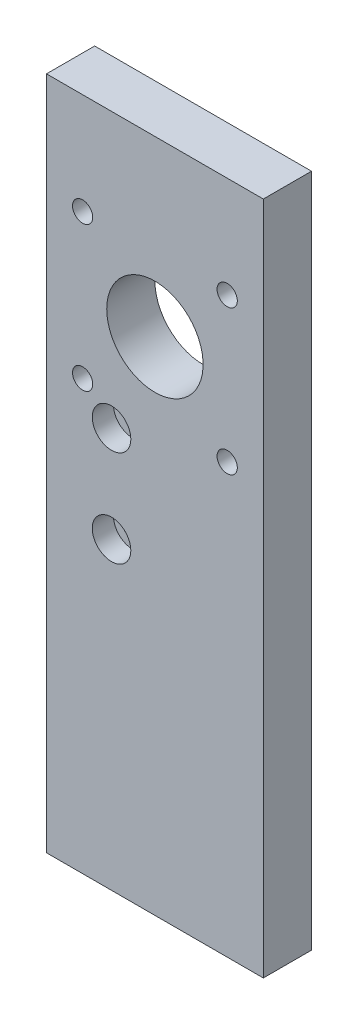
ISO-10303-21;
HEADER;
FILE_DESCRIPTION(('STEP AP214'),'2;1');
FILE_NAME('part.step','',(''),(''),'','','');
FILE_SCHEMA(('AUTOMOTIVE_DESIGN { 1 0 10303 214 1 1 1 1 }'));
ENDSEC;
DATA;
#1=APPLICATION_CONTEXT('core data for automotive mechanical design processes');
#2=APPLICATION_PROTOCOL_DEFINITION('international standard','automotive_design',2000,#1);
#3=PRODUCT_CONTEXT('',#1,'mechanical');
#4=PRODUCT('Part','Part','',(#3));
#5=PRODUCT_RELATED_PRODUCT_CATEGORY('part','',(#4));
#6=PRODUCT_DEFINITION_FORMATION('','',#4);
#7=PRODUCT_DEFINITION_CONTEXT('part definition',#1,'design');
#8=PRODUCT_DEFINITION('design','',#6,#7);
#9=PRODUCT_DEFINITION_SHAPE('','',#8);
#10=(LENGTH_UNIT() NAMED_UNIT(*) SI_UNIT(.MILLI.,.METRE.));
#11=(NAMED_UNIT(*) PLANE_ANGLE_UNIT() SI_UNIT($,.RADIAN.));
#12=(NAMED_UNIT(*) SI_UNIT($,.STERADIAN.) SOLID_ANGLE_UNIT());
#13=UNCERTAINTY_MEASURE_WITH_UNIT(LENGTH_MEASURE(1.E-05),#10,'distance_accuracy_value','');
#14=(GEOMETRIC_REPRESENTATION_CONTEXT(3) GLOBAL_UNCERTAINTY_ASSIGNED_CONTEXT((#13)) GLOBAL_UNIT_ASSIGNED_CONTEXT((#10,
#11,#12)) REPRESENTATION_CONTEXT('',''));
#15=CARTESIAN_POINT('',(0.,0.,0.));
#16=DIRECTION('',(0.,0.,1.));
#17=DIRECTION('',(1.,0.,0.));
#18=AXIS2_PLACEMENT_3D('',#15,#16,#17);
#19=CARTESIAN_POINT('',(-22.5,140.,5.));
#20=DIRECTION('',(1.,0.,0.));
#21=DIRECTION('',(0.,1.,0.));
#22=AXIS2_PLACEMENT_3D('',#19,#20,#21);
#23=PLANE('',#22);
#24=DIRECTION('',(0.,-1.,0.));
#25=VECTOR('',#24,1.);
#26=CARTESIAN_POINT('',(-22.5,140.,-5.));
#27=LINE('',#26,#25);
#28=CARTESIAN_POINT('',(-22.5,140.,-5.));
#29=VERTEX_POINT('',#28);
#30=CARTESIAN_POINT('',(-22.5,0.,-5.));
#31=VERTEX_POINT('',#30);
#32=EDGE_CURVE('E185',#29,#31,#27,.T.);
#33=ORIENTED_EDGE('',*,*,#32,.T.);
#34=DIRECTION('',(0.,0.,-1.));
#35=VECTOR('',#34,1.);
#36=CARTESIAN_POINT('',(-22.5,0.,5.));
#37=LINE('',#36,#35);
#38=CARTESIAN_POINT('',(-22.5,0.,5.));
#39=VERTEX_POINT('',#38);
#40=EDGE_CURVE('E11',#39,#31,#37,.T.);
#41=ORIENTED_EDGE('',*,*,#40,.F.);
#42=DIRECTION('',(0.,-1.,0.));
#43=VECTOR('',#42,1.);
#44=CARTESIAN_POINT('',(-22.5,140.,5.));
#45=LINE('',#44,#43);
#46=CARTESIAN_POINT('',(-22.5,140.,5.));
#47=VERTEX_POINT('',#46);
#48=EDGE_CURVE('E186',#47,#39,#45,.T.);
#49=ORIENTED_EDGE('',*,*,#48,.F.);
#50=DIRECTION('',(0.,0.,-1.));
#51=VECTOR('',#50,1.);
#52=CARTESIAN_POINT('',(-22.5,140.,5.));
#53=LINE('',#52,#51);
#54=EDGE_CURVE('E194',#47,#29,#53,.T.);
#55=ORIENTED_EDGE('',*,*,#54,.T.);
#56=EDGE_LOOP('',(#33,#41,#49,#55));
#57=FACE_BOUND('',#56,.T.);
#58=ADVANCED_FACE('F44',(#57),#23,.F.);
#59=CARTESIAN_POINT('',(-22.5,0.,5.));
#60=DIRECTION('',(0.,1.,0.));
#61=DIRECTION('',(0.,0.,1.));
#62=AXIS2_PLACEMENT_3D('',#59,#60,#61);
#63=PLANE('',#62);
#64=CARTESIAN_POINT('',(-15.,0.,0.));
#65=DIRECTION('',(0.,-1.,0.));
#66=DIRECTION('',(0.,0.,-1.));
#67=AXIS2_PLACEMENT_3D('',#64,#65,#66);
#68=CIRCLE('',#67,2.);
#69=CARTESIAN_POINT('',(-15.,0.,-2.));
#70=VERTEX_POINT('',#69);
#71=EDGE_CURVE('E116',#70,#70,#68,.T.);
#72=ORIENTED_EDGE('',*,*,#71,.F.);
#73=EDGE_LOOP('',(#72));
#74=FACE_BOUND('',#73,.T.);
#75=CARTESIAN_POINT('',(15.,0.,0.));
#76=DIRECTION('',(0.,-1.,0.));
#77=DIRECTION('',(0.,0.,-1.));
#78=AXIS2_PLACEMENT_3D('',#75,#76,#77);
#79=CIRCLE('',#78,2.);
#80=CARTESIAN_POINT('',(15.,0.,-2.));
#81=VERTEX_POINT('',#80);
#82=EDGE_CURVE('E115',#81,#81,#79,.T.);
#83=ORIENTED_EDGE('',*,*,#82,.F.);
#84=EDGE_LOOP('',(#83));
#85=FACE_BOUND('',#84,.T.);
#86=CARTESIAN_POINT('',(0.,0.,0.));
#87=DIRECTION('',(0.,-1.,0.));
#88=DIRECTION('',(0.,0.,-1.));
#89=AXIS2_PLACEMENT_3D('',#86,#87,#88);
#90=CIRCLE('',#89,2.09999999999999);
#91=CARTESIAN_POINT('',(0.,0.,-2.09999999999999));
#92=VERTEX_POINT('',#91);
#93=EDGE_CURVE('E130',#92,#92,#90,.T.);
#94=ORIENTED_EDGE('',*,*,#93,.F.);
#95=EDGE_LOOP('',(#94));
#96=FACE_BOUND('',#95,.T.);
#97=DIRECTION('',(1.,0.,0.));
#98=VECTOR('',#97,1.);
#99=CARTESIAN_POINT('',(-22.5,0.,-5.));
#100=LINE('',#99,#98);
#101=CARTESIAN_POINT('',(22.5,0.,-5.));
#102=VERTEX_POINT('',#101);
#103=EDGE_CURVE('E198',#31,#102,#100,.T.);
#104=ORIENTED_EDGE('',*,*,#103,.T.);
#105=DIRECTION('',(0.,0.,-1.));
#106=VECTOR('',#105,1.);
#107=CARTESIAN_POINT('',(22.5,0.,5.));
#108=LINE('',#107,#106);
#109=CARTESIAN_POINT('',(22.5,0.,5.));
#110=VERTEX_POINT('',#109);
#111=EDGE_CURVE('E52',#110,#102,#108,.T.);
#112=ORIENTED_EDGE('',*,*,#111,.F.);
#113=DIRECTION('',(1.,0.,0.));
#114=VECTOR('',#113,1.);
#115=CARTESIAN_POINT('',(-22.5,0.,5.));
#116=LINE('',#115,#114);
#117=EDGE_CURVE('E91',#39,#110,#116,.T.);
#118=ORIENTED_EDGE('',*,*,#117,.F.);
#119=ORIENTED_EDGE('',*,*,#40,.T.);
#120=EDGE_LOOP('',(#104,#112,#118,#119));
#121=FACE_BOUND('',#120,.T.);
#122=ADVANCED_FACE('F222',(#74,#85,#96,#121),#63,.F.);
#123=CARTESIAN_POINT('',(22.5,140.,5.));
#124=DIRECTION('',(-1.,0.,0.));
#125=DIRECTION('',(0.,-1.,0.));
#126=AXIS2_PLACEMENT_3D('',#123,#124,#125);
#127=PLANE('',#126);
#128=DIRECTION('',(0.,1.,0.));
#129=VECTOR('',#128,1.);
#130=CARTESIAN_POINT('',(22.5,140.,-5.));
#131=LINE('',#130,#129);
#132=CARTESIAN_POINT('',(22.5,140.,-5.));
#133=VERTEX_POINT('',#132);
#134=EDGE_CURVE('E78',#102,#133,#131,.T.);
#135=ORIENTED_EDGE('',*,*,#134,.T.);
#136=DIRECTION('',(0.,0.,-1.));
#137=VECTOR('',#136,1.);
#138=CARTESIAN_POINT('',(22.5,140.,5.));
#139=LINE('',#138,#137);
#140=CARTESIAN_POINT('',(22.5,140.,5.));
#141=VERTEX_POINT('',#140);
#142=EDGE_CURVE('E203',#141,#133,#139,.T.);
#143=ORIENTED_EDGE('',*,*,#142,.F.);
#144=DIRECTION('',(0.,1.,0.));
#145=VECTOR('',#144,1.);
#146=CARTESIAN_POINT('',(22.5,140.,5.));
#147=LINE('',#146,#145);
#148=EDGE_CURVE('E190',#110,#141,#147,.T.);
#149=ORIENTED_EDGE('',*,*,#148,.F.);
#150=ORIENTED_EDGE('',*,*,#111,.T.);
#151=EDGE_LOOP('',(#135,#143,#149,#150));
#152=FACE_BOUND('',#151,.T.);
#153=ADVANCED_FACE('F205',(#152),#127,.F.);
#154=CARTESIAN_POINT('',(-22.5,140.,5.));
#155=DIRECTION('',(0.,-1.,0.));
#156=DIRECTION('',(0.,0.,-1.));
#157=AXIS2_PLACEMENT_3D('',#154,#155,#156);
#158=PLANE('',#157);
#159=DIRECTION('',(-1.,0.,0.));
#160=VECTOR('',#159,1.);
#161=CARTESIAN_POINT('',(-22.5,140.,-5.));
#162=LINE('',#161,#160);
#163=EDGE_CURVE('E84',#133,#29,#162,.T.);
#164=ORIENTED_EDGE('',*,*,#163,.T.);
#165=ORIENTED_EDGE('',*,*,#54,.F.);
#166=DIRECTION('',(-1.,0.,0.));
#167=VECTOR('',#166,1.);
#168=CARTESIAN_POINT('',(-22.5,140.,5.));
#169=LINE('',#168,#167);
#170=EDGE_CURVE('E60',#141,#47,#169,.T.);
#171=ORIENTED_EDGE('',*,*,#170,.F.);
#172=ORIENTED_EDGE('',*,*,#142,.T.);
#173=EDGE_LOOP('',(#164,#165,#171,#172));
#174=FACE_BOUND('',#173,.T.);
#175=ADVANCED_FACE('F212',(#174),#158,.F.);
#176=CARTESIAN_POINT('',(0.,0.,5.));
#177=DIRECTION('',(0.,0.,1.));
#178=DIRECTION('',(1.,0.,0.));
#179=AXIS2_PLACEMENT_3D('',#176,#177,#178);
#180=PLANE('',#179);
#181=CARTESIAN_POINT('',(0.,104.,5.));
#182=DIRECTION('',(0.,0.,-1.));
#183=DIRECTION('',(-1.,0.,0.));
#184=AXIS2_PLACEMENT_3D('',#181,#182,#183);
#185=CIRCLE('',#184,10.);
#186=CARTESIAN_POINT('',(-10.,104.,5.));
#187=VERTEX_POINT('',#186);
#188=EDGE_CURVE('E355',#187,#187,#185,.T.);
#189=ORIENTED_EDGE('',*,*,#188,.T.);
#190=EDGE_LOOP('',(#189));
#191=FACE_BOUND('',#190,.T.);
#192=CARTESIAN_POINT('',(-9.,63.08,5.));
#193=DIRECTION('',(0.,0.,1.));
#194=DIRECTION('',(1.,0.,0.));
#195=AXIS2_PLACEMENT_3D('',#192,#193,#194);
#196=CIRCLE('',#195,4.);
#197=CARTESIAN_POINT('',(-5.,63.08,5.));
#198=VERTEX_POINT('',#197);
#199=EDGE_CURVE('E137',#198,#198,#196,.T.);
#200=ORIENTED_EDGE('',*,*,#199,.F.);
#201=EDGE_LOOP('',(#200));
#202=FACE_BOUND('',#201,.T.);
#203=CARTESIAN_POINT('',(15.,119.,5.));
#204=DIRECTION('',(0.,0.,1.));
#205=DIRECTION('',(1.,0.,0.));
#206=AXIS2_PLACEMENT_3D('',#203,#204,#205);
#207=CIRCLE('',#206,2.1);
#208=CARTESIAN_POINT('',(17.1,119.,5.));
#209=VERTEX_POINT('',#208);
#210=EDGE_CURVE('E149',#209,#209,#207,.T.);
#211=ORIENTED_EDGE('',*,*,#210,.F.);
#212=EDGE_LOOP('',(#211));
#213=FACE_BOUND('',#212,.T.);
#214=CARTESIAN_POINT('',(-15.,89.,5.));
#215=DIRECTION('',(0.,0.,1.));
#216=DIRECTION('',(1.,0.,0.));
#217=AXIS2_PLACEMENT_3D('',#214,#215,#216);
#218=CIRCLE('',#217,2.1);
#219=CARTESIAN_POINT('',(-12.9,89.,5.));
#220=VERTEX_POINT('',#219);
#221=EDGE_CURVE('E155',#220,#220,#218,.T.);
#222=ORIENTED_EDGE('',*,*,#221,.F.);
#223=EDGE_LOOP('',(#222));
#224=FACE_BOUND('',#223,.T.);
#225=CARTESIAN_POINT('',(-15.,119.,5.));
#226=DIRECTION('',(0.,0.,1.));
#227=DIRECTION('',(1.,0.,0.));
#228=AXIS2_PLACEMENT_3D('',#225,#226,#227);
#229=CIRCLE('',#228,2.1);
#230=CARTESIAN_POINT('',(-12.9,119.,5.));
#231=VERTEX_POINT('',#230);
#232=EDGE_CURVE('E161',#231,#231,#229,.T.);
#233=ORIENTED_EDGE('',*,*,#232,.F.);
#234=EDGE_LOOP('',(#233));
#235=FACE_BOUND('',#234,.T.);
#236=CARTESIAN_POINT('',(15.,89.,5.));
#237=DIRECTION('',(0.,0.,1.));
#238=DIRECTION('',(1.,0.,0.));
#239=AXIS2_PLACEMENT_3D('',#236,#237,#238);
#240=CIRCLE('',#239,2.1);
#241=CARTESIAN_POINT('',(17.1,89.,5.));
#242=VERTEX_POINT('',#241);
#243=EDGE_CURVE('E167',#242,#242,#240,.T.);
#244=ORIENTED_EDGE('',*,*,#243,.F.);
#245=EDGE_LOOP('',(#244));
#246=FACE_BOUND('',#245,.T.);
#247=CARTESIAN_POINT('',(-9.,83.08,5.));
#248=DIRECTION('',(0.,0.,1.));
#249=DIRECTION('',(1.,0.,0.));
#250=AXIS2_PLACEMENT_3D('',#247,#248,#249);
#251=CIRCLE('',#250,4.);
#252=CARTESIAN_POINT('',(-5.,83.08,5.));
#253=VERTEX_POINT('',#252);
#254=EDGE_CURVE('E173',#253,#253,#251,.T.);
#255=ORIENTED_EDGE('',*,*,#254,.F.);
#256=EDGE_LOOP('',(#255));
#257=FACE_BOUND('',#256,.T.);
#258=ORIENTED_EDGE('',*,*,#48,.T.);
#259=ORIENTED_EDGE('',*,*,#117,.T.);
#260=ORIENTED_EDGE('',*,*,#148,.T.);
#261=ORIENTED_EDGE('',*,*,#170,.T.);
#262=EDGE_LOOP('',(#258,#259,#260,#261));
#263=FACE_BOUND('',#262,.T.);
#264=ADVANCED_FACE('F214',(#191,#202,#213,#224,#235,#246,#257,#263),#180,.T.);
#265=CARTESIAN_POINT('',(0.,0.,-5.));
#266=DIRECTION('',(0.,0.,1.));
#267=DIRECTION('',(1.,0.,0.));
#268=AXIS2_PLACEMENT_3D('',#265,#266,#267);
#269=PLANE('',#268);
#270=CARTESIAN_POINT('',(0.,104.,-5.));
#271=DIRECTION('',(0.,0.,-1.));
#272=DIRECTION('',(-1.,0.,0.));
#273=AXIS2_PLACEMENT_3D('',#270,#271,#272);
#274=CIRCLE('',#273,9.99999999999999);
#275=CARTESIAN_POINT('',(-9.99999999999999,104.,-5.));
#276=VERTEX_POINT('',#275);
#277=EDGE_CURVE('E301',#276,#276,#274,.T.);
#278=ORIENTED_EDGE('',*,*,#277,.F.);
#279=EDGE_LOOP('',(#278));
#280=FACE_BOUND('',#279,.T.);
#281=CARTESIAN_POINT('',(-17.5,76.5,-5.));
#282=DIRECTION('',(0.,0.,-1.));
#283=DIRECTION('',(-1.,0.,0.));
#284=AXIS2_PLACEMENT_3D('',#281,#282,#283);
#285=CIRCLE('',#284,1.5);
#286=CARTESIAN_POINT('',(-19.,76.5,-5.));
#287=VERTEX_POINT('',#286);
#288=EDGE_CURVE('E305',#287,#287,#285,.T.);
#289=ORIENTED_EDGE('',*,*,#288,.F.);
#290=EDGE_LOOP('',(#289));
#291=FACE_BOUND('',#290,.T.);
#292=CARTESIAN_POINT('',(2.49999999999999,76.5,-5.));
#293=DIRECTION('',(0.,0.,-1.));
#294=DIRECTION('',(-1.,0.,0.));
#295=AXIS2_PLACEMENT_3D('',#292,#293,#294);
#296=CIRCLE('',#295,1.5);
#297=CARTESIAN_POINT('',(0.999999999999993,76.5,-5.));
#298=VERTEX_POINT('',#297);
#299=EDGE_CURVE('E309',#298,#298,#296,.T.);
#300=ORIENTED_EDGE('',*,*,#299,.F.);
#301=EDGE_LOOP('',(#300));
#302=FACE_BOUND('',#301,.T.);
#303=CARTESIAN_POINT('',(-9.,63.08,-5.));
#304=DIRECTION('',(0.,0.,1.));
#305=DIRECTION('',(1.,0.,0.));
#306=AXIS2_PLACEMENT_3D('',#303,#304,#305);
#307=CIRCLE('',#306,2.25);
#308=CARTESIAN_POINT('',(-6.75,63.08,-5.));
#309=VERTEX_POINT('',#308);
#310=EDGE_CURVE('E140',#309,#309,#307,.T.);
#311=ORIENTED_EDGE('',*,*,#310,.T.);
#312=EDGE_LOOP('',(#311));
#313=FACE_BOUND('',#312,.T.);
#314=CARTESIAN_POINT('',(15.,119.,-5.));
#315=DIRECTION('',(0.,0.,1.));
#316=DIRECTION('',(1.,0.,0.));
#317=AXIS2_PLACEMENT_3D('',#314,#315,#316);
#318=CIRCLE('',#317,2.1);
#319=CARTESIAN_POINT('',(17.1,119.,-5.));
#320=VERTEX_POINT('',#319);
#321=EDGE_CURVE('E152',#320,#320,#318,.T.);
#322=ORIENTED_EDGE('',*,*,#321,.T.);
#323=EDGE_LOOP('',(#322));
#324=FACE_BOUND('',#323,.T.);
#325=CARTESIAN_POINT('',(-15.,89.,-5.));
#326=DIRECTION('',(0.,0.,1.));
#327=DIRECTION('',(1.,0.,0.));
#328=AXIS2_PLACEMENT_3D('',#325,#326,#327);
#329=CIRCLE('',#328,2.1);
#330=CARTESIAN_POINT('',(-12.9,89.,-5.));
#331=VERTEX_POINT('',#330);
#332=EDGE_CURVE('E158',#331,#331,#329,.T.);
#333=ORIENTED_EDGE('',*,*,#332,.T.);
#334=EDGE_LOOP('',(#333));
#335=FACE_BOUND('',#334,.T.);
#336=CARTESIAN_POINT('',(-15.,119.,-5.));
#337=DIRECTION('',(0.,0.,1.));
#338=DIRECTION('',(1.,0.,0.));
#339=AXIS2_PLACEMENT_3D('',#336,#337,#338);
#340=CIRCLE('',#339,2.1);
#341=CARTESIAN_POINT('',(-12.9,119.,-5.));
#342=VERTEX_POINT('',#341);
#343=EDGE_CURVE('E164',#342,#342,#340,.T.);
#344=ORIENTED_EDGE('',*,*,#343,.T.);
#345=EDGE_LOOP('',(#344));
#346=FACE_BOUND('',#345,.T.);
#347=CARTESIAN_POINT('',(15.,89.,-5.));
#348=DIRECTION('',(0.,0.,1.));
#349=DIRECTION('',(1.,0.,0.));
#350=AXIS2_PLACEMENT_3D('',#347,#348,#349);
#351=CIRCLE('',#350,2.1);
#352=CARTESIAN_POINT('',(17.1,89.,-5.));
#353=VERTEX_POINT('',#352);
#354=EDGE_CURVE('E170',#353,#353,#351,.T.);
#355=ORIENTED_EDGE('',*,*,#354,.T.);
#356=EDGE_LOOP('',(#355));
#357=FACE_BOUND('',#356,.T.);
#358=CARTESIAN_POINT('',(-9.,83.08,-5.));
#359=DIRECTION('',(0.,0.,1.));
#360=DIRECTION('',(1.,0.,0.));
#361=AXIS2_PLACEMENT_3D('',#358,#359,#360);
#362=CIRCLE('',#361,2.25);
#363=CARTESIAN_POINT('',(-6.75,83.08,-5.));
#364=VERTEX_POINT('',#363);
#365=EDGE_CURVE('E182',#364,#364,#362,.T.);
#366=ORIENTED_EDGE('',*,*,#365,.T.);
#367=EDGE_LOOP('',(#366));
#368=FACE_BOUND('',#367,.T.);
#369=ORIENTED_EDGE('',*,*,#32,.F.);
#370=ORIENTED_EDGE('',*,*,#163,.F.);
#371=ORIENTED_EDGE('',*,*,#134,.F.);
#372=ORIENTED_EDGE('',*,*,#103,.F.);
#373=EDGE_LOOP('',(#369,#370,#371,#372));
#374=FACE_BOUND('',#373,.T.);
#375=ADVANCED_FACE('F208',(#280,#291,#302,#313,#324,#335,#346,#357,#368,#374),#269,.F.);
#376=CARTESIAN_POINT('',(-9.,83.08,5.));
#377=DIRECTION('',(0.,0.,1.));
#378=DIRECTION('',(1.,0.,0.));
#379=AXIS2_PLACEMENT_3D('',#376,#377,#378);
#380=CYLINDRICAL_SURFACE('',#379,2.25);
#381=ORIENTED_EDGE('',*,*,#365,.F.);
#382=EDGE_LOOP('',(#381));
#383=FACE_BOUND('',#382,.T.);
#384=CARTESIAN_POINT('',(-9.,83.08,0.6));
#385=DIRECTION('',(0.,0.,1.));
#386=DIRECTION('',(1.,0.,0.));
#387=AXIS2_PLACEMENT_3D('',#384,#385,#386);
#388=CIRCLE('',#387,2.25);
#389=CARTESIAN_POINT('',(-6.75,83.08,0.6));
#390=VERTEX_POINT('',#389);
#391=EDGE_CURVE('E179',#390,#390,#388,.T.);
#392=ORIENTED_EDGE('',*,*,#391,.T.);
#393=EDGE_LOOP('',(#392));
#394=FACE_BOUND('',#393,.T.);
#395=ADVANCED_FACE('F290',(#383,#394),#380,.F.);
#396=CARTESIAN_POINT('',(-6.75,83.08,0.6));
#397=DIRECTION('',(0.,0.,-1.));
#398=DIRECTION('',(-1.,0.,0.));
#399=AXIS2_PLACEMENT_3D('',#396,#397,#398);
#400=PLANE('',#399);
#401=ORIENTED_EDGE('',*,*,#391,.F.);
#402=EDGE_LOOP('',(#401));
#403=FACE_BOUND('',#402,.T.);
#404=CARTESIAN_POINT('',(-9.,83.08,0.6));
#405=DIRECTION('',(0.,0.,1.));
#406=DIRECTION('',(1.,0.,0.));
#407=AXIS2_PLACEMENT_3D('',#404,#405,#406);
#408=CIRCLE('',#407,4.);
#409=CARTESIAN_POINT('',(-5.,83.08,0.6));
#410=VERTEX_POINT('',#409);
#411=EDGE_CURVE('E176',#410,#410,#408,.T.);
#412=ORIENTED_EDGE('',*,*,#411,.T.);
#413=EDGE_LOOP('',(#412));
#414=FACE_BOUND('',#413,.T.);
#415=ADVANCED_FACE('F286',(#403,#414),#400,.F.);
#416=CARTESIAN_POINT('',(-9.,83.08,5.));
#417=DIRECTION('',(0.,0.,1.));
#418=DIRECTION('',(1.,0.,0.));
#419=AXIS2_PLACEMENT_3D('',#416,#417,#418);
#420=CYLINDRICAL_SURFACE('',#419,4.);
#421=ORIENTED_EDGE('',*,*,#411,.F.);
#422=EDGE_LOOP('',(#421));
#423=FACE_BOUND('',#422,.T.);
#424=ORIENTED_EDGE('',*,*,#254,.T.);
#425=EDGE_LOOP('',(#424));
#426=FACE_BOUND('',#425,.T.);
#427=ADVANCED_FACE('F282',(#423,#426),#420,.F.);
#428=CARTESIAN_POINT('',(15.,89.,5.));
#429=DIRECTION('',(0.,0.,1.));
#430=DIRECTION('',(1.,0.,0.));
#431=AXIS2_PLACEMENT_3D('',#428,#429,#430);
#432=CYLINDRICAL_SURFACE('',#431,2.1);
#433=ORIENTED_EDGE('',*,*,#354,.F.);
#434=EDGE_LOOP('',(#433));
#435=FACE_BOUND('',#434,.T.);
#436=ORIENTED_EDGE('',*,*,#243,.T.);
#437=EDGE_LOOP('',(#436));
#438=FACE_BOUND('',#437,.T.);
#439=ADVANCED_FACE('F278',(#435,#438),#432,.F.);
#440=CARTESIAN_POINT('',(-15.,119.,5.));
#441=DIRECTION('',(0.,0.,1.));
#442=DIRECTION('',(1.,0.,0.));
#443=AXIS2_PLACEMENT_3D('',#440,#441,#442);
#444=CYLINDRICAL_SURFACE('',#443,2.1);
#445=ORIENTED_EDGE('',*,*,#343,.F.);
#446=EDGE_LOOP('',(#445));
#447=FACE_BOUND('',#446,.T.);
#448=ORIENTED_EDGE('',*,*,#232,.T.);
#449=EDGE_LOOP('',(#448));
#450=FACE_BOUND('',#449,.T.);
#451=ADVANCED_FACE('F274',(#447,#450),#444,.F.);
#452=CARTESIAN_POINT('',(-15.,89.,5.));
#453=DIRECTION('',(0.,0.,1.));
#454=DIRECTION('',(1.,0.,0.));
#455=AXIS2_PLACEMENT_3D('',#452,#453,#454);
#456=CYLINDRICAL_SURFACE('',#455,2.1);
#457=ORIENTED_EDGE('',*,*,#332,.F.);
#458=EDGE_LOOP('',(#457));
#459=FACE_BOUND('',#458,.T.);
#460=ORIENTED_EDGE('',*,*,#221,.T.);
#461=EDGE_LOOP('',(#460));
#462=FACE_BOUND('',#461,.T.);
#463=ADVANCED_FACE('F270',(#459,#462),#456,.F.);
#464=CARTESIAN_POINT('',(15.,119.,5.));
#465=DIRECTION('',(0.,0.,1.));
#466=DIRECTION('',(1.,0.,0.));
#467=AXIS2_PLACEMENT_3D('',#464,#465,#466);
#468=CYLINDRICAL_SURFACE('',#467,2.1);
#469=ORIENTED_EDGE('',*,*,#321,.F.);
#470=EDGE_LOOP('',(#469));
#471=FACE_BOUND('',#470,.T.);
#472=ORIENTED_EDGE('',*,*,#210,.T.);
#473=EDGE_LOOP('',(#472));
#474=FACE_BOUND('',#473,.T.);
#475=ADVANCED_FACE('F266',(#471,#474),#468,.F.);
#476=CARTESIAN_POINT('',(-9.,63.08,5.));
#477=DIRECTION('',(0.,0.,1.));
#478=DIRECTION('',(1.,0.,0.));
#479=AXIS2_PLACEMENT_3D('',#476,#477,#478);
#480=CYLINDRICAL_SURFACE('',#479,2.25);
#481=ORIENTED_EDGE('',*,*,#310,.F.);
#482=EDGE_LOOP('',(#481));
#483=FACE_BOUND('',#482,.T.);
#484=CARTESIAN_POINT('',(-9.,63.08,0.6));
#485=DIRECTION('',(0.,0.,1.));
#486=DIRECTION('',(1.,0.,0.));
#487=AXIS2_PLACEMENT_3D('',#484,#485,#486);
#488=CIRCLE('',#487,2.25);
#489=CARTESIAN_POINT('',(-6.75,63.08,0.6));
#490=VERTEX_POINT('',#489);
#491=EDGE_CURVE('E146',#490,#490,#488,.T.);
#492=ORIENTED_EDGE('',*,*,#491,.T.);
#493=EDGE_LOOP('',(#492));
#494=FACE_BOUND('',#493,.T.);
#495=ADVANCED_FACE('F262',(#483,#494),#480,.F.);
#496=CARTESIAN_POINT('',(-6.75,63.08,0.6));
#497=DIRECTION('',(0.,0.,-1.));
#498=DIRECTION('',(-1.,0.,0.));
#499=AXIS2_PLACEMENT_3D('',#496,#497,#498);
#500=PLANE('',#499);
#501=ORIENTED_EDGE('',*,*,#491,.F.);
#502=EDGE_LOOP('',(#501));
#503=FACE_BOUND('',#502,.T.);
#504=CARTESIAN_POINT('',(-9.,63.08,0.6));
#505=DIRECTION('',(0.,0.,1.));
#506=DIRECTION('',(1.,0.,0.));
#507=AXIS2_PLACEMENT_3D('',#504,#505,#506);
#508=CIRCLE('',#507,4.);
#509=CARTESIAN_POINT('',(-5.,63.08,0.6));
#510=VERTEX_POINT('',#509);
#511=EDGE_CURVE('E143',#510,#510,#508,.T.);
#512=ORIENTED_EDGE('',*,*,#511,.T.);
#513=EDGE_LOOP('',(#512));
#514=FACE_BOUND('',#513,.T.);
#515=ADVANCED_FACE('F258',(#503,#514),#500,.F.);
#516=CARTESIAN_POINT('',(-9.,63.08,5.));
#517=DIRECTION('',(0.,0.,1.));
#518=DIRECTION('',(1.,0.,0.));
#519=AXIS2_PLACEMENT_3D('',#516,#517,#518);
#520=CYLINDRICAL_SURFACE('',#519,4.);
#521=ORIENTED_EDGE('',*,*,#511,.F.);
#522=EDGE_LOOP('',(#521));
#523=FACE_BOUND('',#522,.T.);
#524=ORIENTED_EDGE('',*,*,#199,.T.);
#525=EDGE_LOOP('',(#524));
#526=FACE_BOUND('',#525,.T.);
#527=ADVANCED_FACE('F250',(#523,#526),#520,.F.);
#528=CARTESIAN_POINT('',(0.,14.,0.));
#529=DIRECTION('',(0.,-1.,0.));
#530=DIRECTION('',(0.,0.,-1.));
#531=AXIS2_PLACEMENT_3D('',#528,#529,#530);
#532=CONICAL_SURFACE('',#531,2.09999999999999,1.02974425867665);
#533=CARTESIAN_POINT('',(0.,15.2618072999579,0.));
#534=VERTEX_POINT('',#533);
#535=VERTEX_LOOP('',#534);
#536=FACE_BOUND('',#535,.T.);
#537=CARTESIAN_POINT('',(0.,14.,0.));
#538=DIRECTION('',(0.,-1.,0.));
#539=DIRECTION('',(0.,0.,-1.));
#540=AXIS2_PLACEMENT_3D('',#537,#538,#539);
#541=CIRCLE('',#540,2.09999999999999);
#542=CARTESIAN_POINT('',(0.,14.,-2.09999999999999));
#543=VERTEX_POINT('',#542);
#544=EDGE_CURVE('E133',#543,#543,#541,.T.);
#545=ORIENTED_EDGE('',*,*,#544,.T.);
#546=EDGE_LOOP('',(#545));
#547=FACE_BOUND('',#546,.T.);
#548=ADVANCED_FACE('F241',(#536,#547),#532,.F.);
#549=CARTESIAN_POINT('',(0.,0.,0.));
#550=DIRECTION('',(0.,-1.,0.));
#551=DIRECTION('',(0.,0.,-1.));
#552=AXIS2_PLACEMENT_3D('',#549,#550,#551);
#553=CYLINDRICAL_SURFACE('',#552,2.09999999999999);
#554=ORIENTED_EDGE('',*,*,#544,.F.);
#555=EDGE_LOOP('',(#554));
#556=FACE_BOUND('',#555,.T.);
#557=ORIENTED_EDGE('',*,*,#93,.T.);
#558=EDGE_LOOP('',(#557));
#559=FACE_BOUND('',#558,.T.);
#560=ADVANCED_FACE('F238',(#556,#559),#553,.F.);
#561=CARTESIAN_POINT('',(15.,14.,0.));
#562=DIRECTION('',(0.,-1.,0.));
#563=DIRECTION('',(0.,0.,-1.));
#564=AXIS2_PLACEMENT_3D('',#561,#562,#563);
#565=CONICAL_SURFACE('',#564,1.99999999999999,1.02974425867665);
#566=CARTESIAN_POINT('',(15.,15.2017212380551,0.));
#567=VERTEX_POINT('',#566);
#568=VERTEX_LOOP('',#567);
#569=FACE_BOUND('',#568,.T.);
#570=CARTESIAN_POINT('',(15.,14.,0.));
#571=DIRECTION('',(0.,-1.,0.));
#572=DIRECTION('',(0.,0.,-1.));
#573=AXIS2_PLACEMENT_3D('',#570,#571,#572);
#574=CIRCLE('',#573,1.99999999999999);
#575=CARTESIAN_POINT('',(15.,14.,-1.99999999999999));
#576=VERTEX_POINT('',#575);
#577=EDGE_CURVE('E120',#576,#576,#574,.T.);
#578=ORIENTED_EDGE('',*,*,#577,.T.);
#579=EDGE_LOOP('',(#578));
#580=FACE_BOUND('',#579,.T.);
#581=ADVANCED_FACE('F240',(#569,#580),#565,.F.);
#582=CARTESIAN_POINT('',(15.,0.,0.));
#583=DIRECTION('',(0.,-1.,0.));
#584=DIRECTION('',(0.,0.,-1.));
#585=AXIS2_PLACEMENT_3D('',#582,#583,#584);
#586=CYLINDRICAL_SURFACE('',#585,2.);
#587=ORIENTED_EDGE('',*,*,#577,.F.);
#588=EDGE_LOOP('',(#587));
#589=FACE_BOUND('',#588,.T.);
#590=ORIENTED_EDGE('',*,*,#82,.T.);
#591=EDGE_LOOP('',(#590));
#592=FACE_BOUND('',#591,.T.);
#593=ADVANCED_FACE('F108',(#589,#592),#586,.F.);
#594=CARTESIAN_POINT('',(-15.,14.,0.));
#595=DIRECTION('',(0.,-1.,0.));
#596=DIRECTION('',(0.,0.,-1.));
#597=AXIS2_PLACEMENT_3D('',#594,#595,#596);
#598=CONICAL_SURFACE('',#597,2.,1.02974425867665);
#599=CARTESIAN_POINT('',(-15.,15.2017212380551,0.));
#600=VERTEX_POINT('',#599);
#601=VERTEX_LOOP('',#600);
#602=FACE_BOUND('',#601,.T.);
#603=CARTESIAN_POINT('',(-15.,14.,0.));
#604=DIRECTION('',(0.,-1.,0.));
#605=DIRECTION('',(0.,0.,-1.));
#606=AXIS2_PLACEMENT_3D('',#603,#604,#605);
#607=CIRCLE('',#606,2.);
#608=CARTESIAN_POINT('',(-15.,14.,-2.));
#609=VERTEX_POINT('',#608);
#610=EDGE_CURVE('E112',#609,#609,#607,.T.);
#611=ORIENTED_EDGE('',*,*,#610,.T.);
#612=EDGE_LOOP('',(#611));
#613=FACE_BOUND('',#612,.T.);
#614=ADVANCED_FACE('F104',(#602,#613),#598,.F.);
#615=CARTESIAN_POINT('',(-15.,0.,0.));
#616=DIRECTION('',(0.,-1.,0.));
#617=DIRECTION('',(0.,0.,-1.));
#618=AXIS2_PLACEMENT_3D('',#615,#616,#617);
#619=CYLINDRICAL_SURFACE('',#618,2.);
#620=ORIENTED_EDGE('',*,*,#610,.F.);
#621=EDGE_LOOP('',(#620));
#622=FACE_BOUND('',#621,.T.);
#623=ORIENTED_EDGE('',*,*,#71,.T.);
#624=EDGE_LOOP('',(#623));
#625=FACE_BOUND('',#624,.T.);
#626=ADVANCED_FACE('F107',(#622,#625),#619,.F.);
#627=CARTESIAN_POINT('',(2.49999999999999,76.5,3.));
#628=DIRECTION('',(0.,0.,1.));
#629=DIRECTION('',(1.,0.,0.));
#630=AXIS2_PLACEMENT_3D('',#627,#628,#629);
#631=PLANE('',#630);
#632=CARTESIAN_POINT('',(2.49999999999999,76.5,3.));
#633=DIRECTION('',(0.,0.,-1.));
#634=DIRECTION('',(-1.,0.,0.));
#635=AXIS2_PLACEMENT_3D('',#632,#633,#634);
#636=CIRCLE('',#635,1.5);
#637=CARTESIAN_POINT('',(0.999999999999994,76.5,3.));
#638=VERTEX_POINT('',#637);
#639=EDGE_CURVE('E123',#638,#638,#636,.T.);
#640=ORIENTED_EDGE('',*,*,#639,.T.);
#641=EDGE_LOOP('',(#640));
#642=FACE_BOUND('',#641,.T.);
#643=ADVANCED_FACE('F378',(#642),#631,.F.);
#644=CARTESIAN_POINT('',(2.49999999999999,76.5,-5.));
#645=DIRECTION('',(0.,0.,-1.));
#646=DIRECTION('',(-1.,0.,0.));
#647=AXIS2_PLACEMENT_3D('',#644,#645,#646);
#648=CYLINDRICAL_SURFACE('',#647,1.5);
#649=ORIENTED_EDGE('',*,*,#639,.F.);
#650=EDGE_LOOP('',(#649));
#651=FACE_BOUND('',#650,.T.);
#652=ORIENTED_EDGE('',*,*,#299,.T.);
#653=EDGE_LOOP('',(#652));
#654=FACE_BOUND('',#653,.T.);
#655=ADVANCED_FACE('F374',(#651,#654),#648,.F.);
#656=CARTESIAN_POINT('',(-17.5,76.5,3.));
#657=DIRECTION('',(0.,0.,1.));
#658=DIRECTION('',(1.,0.,0.));
#659=AXIS2_PLACEMENT_3D('',#656,#657,#658);
#660=PLANE('',#659);
#661=CARTESIAN_POINT('',(-17.5,76.5,3.));
#662=DIRECTION('',(0.,0.,-1.));
#663=DIRECTION('',(-1.,0.,0.));
#664=AXIS2_PLACEMENT_3D('',#661,#662,#663);
#665=CIRCLE('',#664,1.5);
#666=CARTESIAN_POINT('',(-19.,76.5,3.));
#667=VERTEX_POINT('',#666);
#668=EDGE_CURVE('E348',#667,#667,#665,.T.);
#669=ORIENTED_EDGE('',*,*,#668,.T.);
#670=EDGE_LOOP('',(#669));
#671=FACE_BOUND('',#670,.T.);
#672=ADVANCED_FACE('F367',(#671),#660,.F.);
#673=CARTESIAN_POINT('',(-17.5,76.5,-5.));
#674=DIRECTION('',(0.,0.,-1.));
#675=DIRECTION('',(-1.,0.,0.));
#676=AXIS2_PLACEMENT_3D('',#673,#674,#675);
#677=CYLINDRICAL_SURFACE('',#676,1.5);
#678=ORIENTED_EDGE('',*,*,#668,.F.);
#679=EDGE_LOOP('',(#678));
#680=FACE_BOUND('',#679,.T.);
#681=ORIENTED_EDGE('',*,*,#288,.T.);
#682=EDGE_LOOP('',(#681));
#683=FACE_BOUND('',#682,.T.);
#684=ADVANCED_FACE('F361',(#680,#683),#677,.F.);
#685=CARTESIAN_POINT('',(0.,104.,-5.));
#686=DIRECTION('',(0.,0.,-1.));
#687=DIRECTION('',(-1.,0.,0.));
#688=AXIS2_PLACEMENT_3D('',#685,#686,#687);
#689=CYLINDRICAL_SURFACE('',#688,9.99999999999999);
#690=ORIENTED_EDGE('',*,*,#188,.F.);
#691=EDGE_LOOP('',(#690));
#692=FACE_BOUND('',#691,.T.);
#693=ORIENTED_EDGE('',*,*,#277,.T.);
#694=EDGE_LOOP('',(#693));
#695=FACE_BOUND('',#694,.T.);
#696=ADVANCED_FACE('F359',(#692,#695),#689,.F.);
#697=CLOSED_SHELL('',(#58,#122,#153,#175,#264,#375,#395,#415,#427,#439,#451,#463,#475,#495,#515,
#527,#548,#560,#581,#593,#614,#626,#643,#655,#672,#684,#696));
#698=MANIFOLD_SOLID_BREP('B2',#697);
#699=ADVANCED_BREP_SHAPE_REPRESENTATION('',(#18,#698),#14);
#700=SHAPE_DEFINITION_REPRESENTATION(#9,#699);
ENDSEC;
END-ISO-10303-21;
